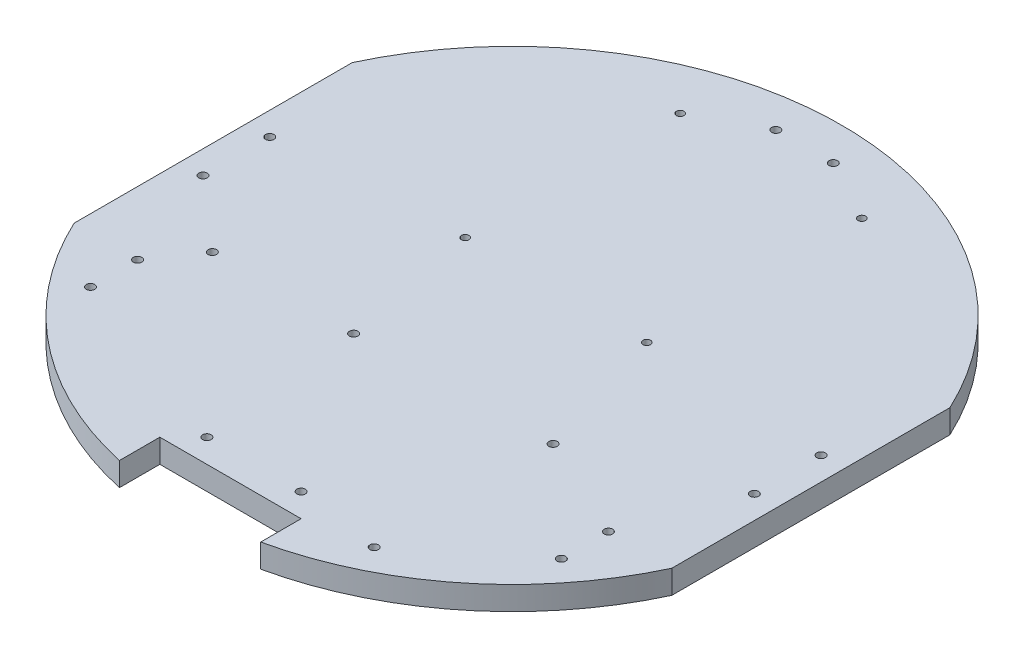
ISO-10303-21;
HEADER;
FILE_DESCRIPTION(('STEP AP214'),'2;1');
FILE_NAME('part.step','',(''),(''),'','','');
FILE_SCHEMA(('AUTOMOTIVE_DESIGN { 1 0 10303 214 1 1 1 1 }'));
ENDSEC;
DATA;
#1=APPLICATION_CONTEXT('core data for automotive mechanical design processes');
#2=APPLICATION_PROTOCOL_DEFINITION('international standard','automotive_design',2000,#1);
#3=PRODUCT_CONTEXT('',#1,'mechanical');
#4=PRODUCT('Part','Part','',(#3));
#5=PRODUCT_RELATED_PRODUCT_CATEGORY('part','',(#4));
#6=PRODUCT_DEFINITION_FORMATION('','',#4);
#7=PRODUCT_DEFINITION_CONTEXT('part definition',#1,'design');
#8=PRODUCT_DEFINITION('design','',#6,#7);
#9=PRODUCT_DEFINITION_SHAPE('','',#8);
#10=(LENGTH_UNIT() NAMED_UNIT(*) SI_UNIT(.MILLI.,.METRE.));
#11=(NAMED_UNIT(*) PLANE_ANGLE_UNIT() SI_UNIT($,.RADIAN.));
#12=(NAMED_UNIT(*) SI_UNIT($,.STERADIAN.) SOLID_ANGLE_UNIT());
#13=UNCERTAINTY_MEASURE_WITH_UNIT(LENGTH_MEASURE(1.E-05),#10,'distance_accuracy_value','');
#14=(GEOMETRIC_REPRESENTATION_CONTEXT(3) GLOBAL_UNCERTAINTY_ASSIGNED_CONTEXT((#13)) GLOBAL_UNIT_ASSIGNED_CONTEXT((#10,
#11,#12)) REPRESENTATION_CONTEXT('',''));
#15=CARTESIAN_POINT('',(0.,0.,0.));
#16=DIRECTION('',(0.,0.,1.));
#17=DIRECTION('',(1.,0.,0.));
#18=AXIS2_PLACEMENT_3D('',#15,#16,#17);
#19=CARTESIAN_POINT('',(0.,6.35,0.));
#20=DIRECTION('',(0.,-1.,0.));
#21=DIRECTION('',(0.,0.,-1.));
#22=AXIS2_PLACEMENT_3D('',#19,#20,#21);
#23=CYLINDRICAL_SURFACE('',#22,88.9);
#24=CARTESIAN_POINT('',(0.,0.,0.));
#25=DIRECTION('',(0.,1.,0.));
#26=DIRECTION('',(0.,0.,1.));
#27=AXIS2_PLACEMENT_3D('',#24,#25,#26);
#28=CIRCLE('',#27,88.9);
#29=CARTESIAN_POINT('',(-80.6037219984288,0.,37.5));
#30=VERTEX_POINT('',#29);
#31=CARTESIAN_POINT('',(-19.05,0.,86.8349440029761));
#32=VERTEX_POINT('',#31);
#33=EDGE_CURVE('E274',#30,#32,#28,.T.);
#34=ORIENTED_EDGE('',*,*,#33,.T.);
#35=DIRECTION('',(0.,-1.,0.));
#36=VECTOR('',#35,1.);
#37=CARTESIAN_POINT('',(-19.05,6.35,86.8349440029761));
#38=LINE('',#37,#36);
#39=CARTESIAN_POINT('',(-19.05,6.35,86.8349440029761));
#40=VERTEX_POINT('',#39);
#41=EDGE_CURVE('E121',#32,#40,#38,.F.);
#42=ORIENTED_EDGE('',*,*,#41,.T.);
#43=CARTESIAN_POINT('',(0.,6.35,0.));
#44=DIRECTION('',(0.,1.,0.));
#45=DIRECTION('',(0.,0.,1.));
#46=AXIS2_PLACEMENT_3D('',#43,#44,#45);
#47=CIRCLE('',#46,88.9);
#48=CARTESIAN_POINT('',(-80.6037219984288,6.35,37.5));
#49=VERTEX_POINT('',#48);
#50=EDGE_CURVE('E264',#49,#40,#47,.T.);
#51=ORIENTED_EDGE('',*,*,#50,.F.);
#52=DIRECTION('',(0.,-1.,0.));
#53=VECTOR('',#52,1.);
#54=CARTESIAN_POINT('',(-80.6037219984288,6.35,37.5));
#55=LINE('',#54,#53);
#56=EDGE_CURVE('E280',#49,#30,#55,.T.);
#57=ORIENTED_EDGE('',*,*,#56,.T.);
#58=EDGE_LOOP('',(#34,#42,#51,#57));
#59=FACE_BOUND('',#58,.T.);
#60=ADVANCED_FACE('F33',(#59),#23,.T.);
#61=CARTESIAN_POINT('',(0.,6.35,0.));
#62=DIRECTION('',(0.,-1.,0.));
#63=DIRECTION('',(0.,0.,-1.));
#64=AXIS2_PLACEMENT_3D('',#61,#62,#63);
#65=CYLINDRICAL_SURFACE('',#64,88.9);
#66=CARTESIAN_POINT('',(0.,0.,0.));
#67=DIRECTION('',(0.,1.,0.));
#68=DIRECTION('',(0.,0.,1.));
#69=AXIS2_PLACEMENT_3D('',#66,#67,#68);
#70=CIRCLE('',#69,88.9);
#71=CARTESIAN_POINT('',(80.6037219984288,0.,-37.5));
#72=VERTEX_POINT('',#71);
#73=CARTESIAN_POINT('',(-80.6037219984288,0.,-37.5));
#74=VERTEX_POINT('',#73);
#75=EDGE_CURVE('E259',#72,#74,#70,.T.);
#76=ORIENTED_EDGE('',*,*,#75,.T.);
#77=DIRECTION('',(0.,-1.,0.));
#78=VECTOR('',#77,1.);
#79=CARTESIAN_POINT('',(-80.6037219984288,6.35,-37.5));
#80=LINE('',#79,#78);
#81=CARTESIAN_POINT('',(-80.6037219984288,6.35,-37.5));
#82=VERTEX_POINT('',#81);
#83=EDGE_CURVE('E41',#82,#74,#80,.T.);
#84=ORIENTED_EDGE('',*,*,#83,.F.);
#85=CARTESIAN_POINT('',(0.,6.35,0.));
#86=DIRECTION('',(0.,1.,0.));
#87=DIRECTION('',(0.,0.,1.));
#88=AXIS2_PLACEMENT_3D('',#85,#86,#87);
#89=CIRCLE('',#88,88.9);
#90=CARTESIAN_POINT('',(80.6037219984288,6.35,-37.5));
#91=VERTEX_POINT('',#90);
#92=EDGE_CURVE('E260',#91,#82,#89,.T.);
#93=ORIENTED_EDGE('',*,*,#92,.F.);
#94=DIRECTION('',(0.,-1.,0.));
#95=VECTOR('',#94,1.);
#96=CARTESIAN_POINT('',(80.6037219984288,6.35,-37.5));
#97=LINE('',#96,#95);
#98=EDGE_CURVE('E268',#91,#72,#97,.T.);
#99=ORIENTED_EDGE('',*,*,#98,.T.);
#100=EDGE_LOOP('',(#76,#84,#93,#99));
#101=FACE_BOUND('',#100,.T.);
#102=ADVANCED_FACE('F35',(#101),#65,.T.);
#103=CARTESIAN_POINT('',(-80.6037219984288,6.35,-37.5));
#104=DIRECTION('',(1.,0.,0.));
#105=DIRECTION('',(0.,0.,-1.));
#106=AXIS2_PLACEMENT_3D('',#103,#104,#105);
#107=PLANE('',#106);
#108=DIRECTION('',(0.,0.,1.));
#109=VECTOR('',#108,1.);
#110=CARTESIAN_POINT('',(-80.6037219984288,0.,-37.5));
#111=LINE('',#110,#109);
#112=EDGE_CURVE('E271',#74,#30,#111,.T.);
#113=ORIENTED_EDGE('',*,*,#112,.T.);
#114=ORIENTED_EDGE('',*,*,#56,.F.);
#115=DIRECTION('',(0.,0.,1.));
#116=VECTOR('',#115,1.);
#117=CARTESIAN_POINT('',(-80.6037219984288,6.35,-37.5));
#118=LINE('',#117,#116);
#119=EDGE_CURVE('E86',#82,#49,#118,.T.);
#120=ORIENTED_EDGE('',*,*,#119,.F.);
#121=ORIENTED_EDGE('',*,*,#83,.T.);
#122=EDGE_LOOP('',(#113,#114,#120,#121));
#123=FACE_BOUND('',#122,.T.);
#124=ADVANCED_FACE('F283',(#123),#107,.F.);
#125=CARTESIAN_POINT('',(19.05,6.35,86.8349440029761));
#126=VERTEX_POINT('',#125);
#127=CARTESIAN_POINT('',(80.6037219984288,6.35,37.5));
#128=VERTEX_POINT('',#127);
#129=EDGE_CURVE('E263',#126,#128,#47,.T.);
#130=ORIENTED_EDGE('',*,*,#129,.F.);
#131=DIRECTION('',(0.,-1.,0.));
#132=VECTOR('',#131,1.);
#133=CARTESIAN_POINT('',(19.05,6.35,86.8349440029761));
#134=LINE('',#133,#132);
#135=CARTESIAN_POINT('',(19.05,0.,86.8349440029761));
#136=VERTEX_POINT('',#135);
#137=EDGE_CURVE('E114',#126,#136,#134,.T.);
#138=ORIENTED_EDGE('',*,*,#137,.T.);
#139=CARTESIAN_POINT('',(80.6037219984288,0.,37.5));
#140=VERTEX_POINT('',#139);
#141=EDGE_CURVE('E273',#136,#140,#28,.T.);
#142=ORIENTED_EDGE('',*,*,#141,.T.);
#143=DIRECTION('',(0.,-1.,0.));
#144=VECTOR('',#143,1.);
#145=CARTESIAN_POINT('',(80.6037219984288,6.35,37.5));
#146=LINE('',#145,#144);
#147=EDGE_CURVE('E278',#128,#140,#146,.T.);
#148=ORIENTED_EDGE('',*,*,#147,.F.);
#149=EDGE_LOOP('',(#130,#138,#142,#148));
#150=FACE_BOUND('',#149,.T.);
#151=ADVANCED_FACE('F296',(#150),#23,.T.);
#152=CARTESIAN_POINT('',(80.6037219984288,6.35,-37.5));
#153=DIRECTION('',(-1.,0.,0.));
#154=DIRECTION('',(0.,0.,1.));
#155=AXIS2_PLACEMENT_3D('',#152,#153,#154);
#156=PLANE('',#155);
#157=DIRECTION('',(0.,0.,-1.));
#158=VECTOR('',#157,1.);
#159=CARTESIAN_POINT('',(80.6037219984288,0.,-37.5));
#160=LINE('',#159,#158);
#161=EDGE_CURVE('E78',#140,#72,#160,.T.);
#162=ORIENTED_EDGE('',*,*,#161,.T.);
#163=ORIENTED_EDGE('',*,*,#98,.F.);
#164=DIRECTION('',(0.,0.,-1.));
#165=VECTOR('',#164,1.);
#166=CARTESIAN_POINT('',(80.6037219984288,6.35,-37.5));
#167=LINE('',#166,#165);
#168=EDGE_CURVE('E57',#128,#91,#167,.T.);
#169=ORIENTED_EDGE('',*,*,#168,.F.);
#170=ORIENTED_EDGE('',*,*,#147,.T.);
#171=EDGE_LOOP('',(#162,#163,#169,#170));
#172=FACE_BOUND('',#171,.T.);
#173=ADVANCED_FACE('F297',(#172),#156,.F.);
#174=CARTESIAN_POINT('',(0.,6.35,0.));
#175=DIRECTION('',(0.,1.,0.));
#176=DIRECTION('',(0.,0.,1.));
#177=AXIS2_PLACEMENT_3D('',#174,#175,#176);
#178=PLANE('',#177);
#179=DIRECTION('',(0.,0.,1.));
#180=VECTOR('',#179,1.);
#181=CARTESIAN_POINT('',(-19.05,6.35,101.854));
#182=LINE('',#181,#180);
#183=CARTESIAN_POINT('',(-19.05,6.35,75.946));
#184=VERTEX_POINT('',#183);
#185=EDGE_CURVE('E128',#184,#40,#182,.T.);
#186=ORIENTED_EDGE('',*,*,#185,.F.);
#187=DIRECTION('',(-1.,0.,0.));
#188=VECTOR('',#187,1.);
#189=CARTESIAN_POINT('',(19.05,6.35,75.946));
#190=LINE('',#189,#188);
#191=CARTESIAN_POINT('',(19.05,6.35,75.946));
#192=VERTEX_POINT('',#191);
#193=EDGE_CURVE('E111',#192,#184,#190,.T.);
#194=ORIENTED_EDGE('',*,*,#193,.F.);
#195=DIRECTION('',(0.,0.,-1.));
#196=VECTOR('',#195,1.);
#197=CARTESIAN_POINT('',(19.05,6.35,101.854));
#198=LINE('',#197,#196);
#199=EDGE_CURVE('E132',#126,#192,#198,.T.);
#200=ORIENTED_EDGE('',*,*,#199,.F.);
#201=ORIENTED_EDGE('',*,*,#129,.T.);
#202=ORIENTED_EDGE('',*,*,#168,.T.);
#203=ORIENTED_EDGE('',*,*,#92,.T.);
#204=ORIENTED_EDGE('',*,*,#119,.T.);
#205=ORIENTED_EDGE('',*,*,#50,.T.);
#206=EDGE_LOOP('',(#186,#194,#200,#201,#202,#203,#204,#205));
#207=FACE_BOUND('',#206,.T.);
#208=CARTESIAN_POINT('',(-17.1037219984288,6.35,25.6290866600361));
#209=DIRECTION('',(0.,1.,0.));
#210=DIRECTION('',(0.,0.,1.));
#211=AXIS2_PLACEMENT_3D('',#208,#209,#210);
#212=CIRCLE('',#211,1.143);
#213=CARTESIAN_POINT('',(-17.1037219984288,6.35,26.7720866600361));
#214=VERTEX_POINT('',#213);
#215=EDGE_CURVE('E139',#214,#214,#212,.T.);
#216=ORIENTED_EDGE('',*,*,#215,.F.);
#217=EDGE_LOOP('',(#216));
#218=FACE_BOUND('',#217,.T.);
#219=CARTESIAN_POINT('',(-55.2037219984288,6.35,25.6290866600361));
#220=DIRECTION('',(0.,1.,0.));
#221=DIRECTION('',(0.,0.,1.));
#222=AXIS2_PLACEMENT_3D('',#219,#220,#221);
#223=CIRCLE('',#222,1.143);
#224=CARTESIAN_POINT('',(-55.2037219984288,6.35,26.7720866600361));
#225=VERTEX_POINT('',#224);
#226=EDGE_CURVE('E143',#225,#225,#223,.T.);
#227=ORIENTED_EDGE('',*,*,#226,.F.);
#228=EDGE_LOOP('',(#227));
#229=FACE_BOUND('',#228,.T.);
#230=CARTESIAN_POINT('',(63.5,6.35,37.5));
#231=DIRECTION('',(0.,1.,0.));
#232=DIRECTION('',(0.,0.,-1.));
#233=AXIS2_PLACEMENT_3D('',#230,#231,#232);
#234=CIRCLE('',#233,1.14300000000002);
#235=CARTESIAN_POINT('',(63.5,6.35,36.357));
#236=VERTEX_POINT('',#235);
#237=EDGE_CURVE('E149',#236,#236,#234,.T.);
#238=ORIENTED_EDGE('',*,*,#237,.F.);
#239=EDGE_LOOP('',(#238));
#240=FACE_BOUND('',#239,.T.);
#241=CARTESIAN_POINT('',(63.5,6.35,50.2));
#242=DIRECTION('',(0.,1.,0.));
#243=DIRECTION('',(0.,0.,-1.));
#244=AXIS2_PLACEMENT_3D('',#241,#242,#243);
#245=CIRCLE('',#244,1.14300000000002);
#246=CARTESIAN_POINT('',(63.5,6.35,49.057));
#247=VERTEX_POINT('',#246);
#248=EDGE_CURVE('E155',#247,#247,#245,.T.);
#249=ORIENTED_EDGE('',*,*,#248,.F.);
#250=EDGE_LOOP('',(#249));
#251=FACE_BOUND('',#250,.T.);
#252=CARTESIAN_POINT('',(-63.5,6.35,50.2));
#253=DIRECTION('',(0.,1.,0.));
#254=DIRECTION('',(0.,0.,1.));
#255=AXIS2_PLACEMENT_3D('',#252,#253,#254);
#256=CIRCLE('',#255,1.14300000000002);
#257=CARTESIAN_POINT('',(-63.5,6.35,51.343));
#258=VERTEX_POINT('',#257);
#259=EDGE_CURVE('E161',#258,#258,#256,.T.);
#260=ORIENTED_EDGE('',*,*,#259,.F.);
#261=EDGE_LOOP('',(#260));
#262=FACE_BOUND('',#261,.T.);
#263=CARTESIAN_POINT('',(-63.5,6.35,37.5));
#264=DIRECTION('',(0.,1.,0.));
#265=DIRECTION('',(0.,0.,1.));
#266=AXIS2_PLACEMENT_3D('',#263,#264,#265);
#267=CIRCLE('',#266,1.14300000000002);
#268=CARTESIAN_POINT('',(-63.5,6.35,38.643));
#269=VERTEX_POINT('',#268);
#270=EDGE_CURVE('E167',#269,#269,#267,.T.);
#271=ORIENTED_EDGE('',*,*,#270,.F.);
#272=EDGE_LOOP('',(#271));
#273=FACE_BOUND('',#272,.T.);
#274=CARTESIAN_POINT('',(12.7,6.35,69.596));
#275=DIRECTION('',(0.,1.,0.));
#276=DIRECTION('',(0.,0.,1.));
#277=AXIS2_PLACEMENT_3D('',#274,#275,#276);
#278=CIRCLE('',#277,1.14299999999999);
#279=CARTESIAN_POINT('',(12.7,6.35,70.739));
#280=VERTEX_POINT('',#279);
#281=EDGE_CURVE('E173',#280,#280,#278,.T.);
#282=ORIENTED_EDGE('',*,*,#281,.F.);
#283=EDGE_LOOP('',(#282));
#284=FACE_BOUND('',#283,.T.);
#285=CARTESIAN_POINT('',(-12.7,6.35,69.596));
#286=DIRECTION('',(0.,1.,0.));
#287=DIRECTION('',(0.,0.,1.));
#288=AXIS2_PLACEMENT_3D('',#285,#286,#287);
#289=CIRCLE('',#288,1.14300000000001);
#290=CARTESIAN_POINT('',(-12.7,6.35,70.739));
#291=VERTEX_POINT('',#290);
#292=EDGE_CURVE('E179',#291,#291,#289,.T.);
#293=ORIENTED_EDGE('',*,*,#292,.F.);
#294=EDGE_LOOP('',(#293));
#295=FACE_BOUND('',#294,.T.);
#296=CARTESIAN_POINT('',(35.56,6.35,72.746086660036));
#297=DIRECTION('',(0.,1.,0.));
#298=DIRECTION('',(0.,0.,1.));
#299=AXIS2_PLACEMENT_3D('',#296,#297,#298);
#300=CIRCLE('',#299,1.143);
#301=CARTESIAN_POINT('',(35.56,6.35,73.889086660036));
#302=VERTEX_POINT('',#301);
#303=EDGE_CURVE('E185',#302,#302,#300,.T.);
#304=ORIENTED_EDGE('',*,*,#303,.F.);
#305=EDGE_LOOP('',(#304));
#306=FACE_BOUND('',#305,.T.);
#307=CARTESIAN_POINT('',(35.56,6.35,24.486086660036));
#308=DIRECTION('',(0.,1.,0.));
#309=DIRECTION('',(0.,0.,1.));
#310=AXIS2_PLACEMENT_3D('',#307,#308,#309);
#311=CIRCLE('',#310,1.143);
#312=CARTESIAN_POINT('',(35.56,6.35,25.629086660036));
#313=VERTEX_POINT('',#312);
#314=EDGE_CURVE('E191',#313,#313,#311,.T.);
#315=ORIENTED_EDGE('',*,*,#314,.F.);
#316=EDGE_LOOP('',(#315));
#317=FACE_BOUND('',#316,.T.);
#318=CARTESIAN_POINT('',(7.747,6.35,-78.9));
#319=DIRECTION('',(0.,1.,0.));
#320=DIRECTION('',(0.,0.,1.));
#321=AXIS2_PLACEMENT_3D('',#318,#319,#320);
#322=CIRCLE('',#321,1.14300000000001);
#323=CARTESIAN_POINT('',(7.747,6.35,-77.757));
#324=VERTEX_POINT('',#323);
#325=EDGE_CURVE('E197',#324,#324,#322,.T.);
#326=ORIENTED_EDGE('',*,*,#325,.F.);
#327=EDGE_LOOP('',(#326));
#328=FACE_BOUND('',#327,.T.);
#329=CARTESIAN_POINT('',(-7.747,6.35,-78.9));
#330=DIRECTION('',(0.,1.,0.));
#331=DIRECTION('',(0.,0.,1.));
#332=AXIS2_PLACEMENT_3D('',#329,#330,#331);
#333=CIRCLE('',#332,1.14299999999999);
#334=CARTESIAN_POINT('',(-7.747,6.35,-77.757));
#335=VERTEX_POINT('',#334);
#336=EDGE_CURVE('E205',#335,#335,#333,.T.);
#337=ORIENTED_EDGE('',*,*,#336,.F.);
#338=EDGE_LOOP('',(#337));
#339=FACE_BOUND('',#338,.T.);
#340=CARTESIAN_POINT('',(74.3537219984288,6.35,9.));
#341=DIRECTION('',(0.,1.,0.));
#342=DIRECTION('',(0.,0.,-1.));
#343=AXIS2_PLACEMENT_3D('',#340,#341,#342);
#344=CIRCLE('',#343,1.14299999999999);
#345=CARTESIAN_POINT('',(74.3537219984288,6.35,7.85700000000001));
#346=VERTEX_POINT('',#345);
#347=EDGE_CURVE('E211',#346,#346,#344,.T.);
#348=ORIENTED_EDGE('',*,*,#347,.F.);
#349=EDGE_LOOP('',(#348));
#350=FACE_BOUND('',#349,.T.);
#351=CARTESIAN_POINT('',(74.3537219984288,6.35,-9.));
#352=DIRECTION('',(0.,1.,0.));
#353=DIRECTION('',(0.,0.,-1.));
#354=AXIS2_PLACEMENT_3D('',#351,#352,#353);
#355=CIRCLE('',#354,1.14299999999999);
#356=CARTESIAN_POINT('',(74.3537219984288,6.35,-10.143));
#357=VERTEX_POINT('',#356);
#358=EDGE_CURVE('E217',#357,#357,#355,.T.);
#359=ORIENTED_EDGE('',*,*,#358,.F.);
#360=EDGE_LOOP('',(#359));
#361=FACE_BOUND('',#360,.T.);
#362=CARTESIAN_POINT('',(-74.3537219984288,6.35,9.));
#363=DIRECTION('',(0.,1.,0.));
#364=DIRECTION('',(0.,0.,1.));
#365=AXIS2_PLACEMENT_3D('',#362,#363,#364);
#366=CIRCLE('',#365,1.14299999999999);
#367=CARTESIAN_POINT('',(-74.3537219984288,6.35,10.143));
#368=VERTEX_POINT('',#367);
#369=EDGE_CURVE('E223',#368,#368,#366,.T.);
#370=ORIENTED_EDGE('',*,*,#369,.F.);
#371=EDGE_LOOP('',(#370));
#372=FACE_BOUND('',#371,.T.);
#373=CARTESIAN_POINT('',(-74.3537219984288,6.35,-9.));
#374=DIRECTION('',(0.,1.,0.));
#375=DIRECTION('',(0.,0.,1.));
#376=AXIS2_PLACEMENT_3D('',#373,#374,#375);
#377=CIRCLE('',#376,1.14299999999999);
#378=CARTESIAN_POINT('',(-74.3537219984288,6.35,-7.85700000000001));
#379=VERTEX_POINT('',#378);
#380=EDGE_CURVE('E229',#379,#379,#377,.T.);
#381=ORIENTED_EDGE('',*,*,#380,.F.);
#382=EDGE_LOOP('',(#381));
#383=FACE_BOUND('',#382,.T.);
#384=CARTESIAN_POINT('',(-24.5,6.35,-69.85));
#385=DIRECTION('',(0.,1.,0.));
#386=DIRECTION('',(0.,0.,1.));
#387=AXIS2_PLACEMENT_3D('',#384,#385,#386);
#388=CIRCLE('',#387,1.025);
#389=CARTESIAN_POINT('',(-24.5,6.35,-68.825));
#390=VERTEX_POINT('',#389);
#391=EDGE_CURVE('E235',#390,#390,#388,.T.);
#392=ORIENTED_EDGE('',*,*,#391,.F.);
#393=EDGE_LOOP('',(#392));
#394=FACE_BOUND('',#393,.T.);
#395=CARTESIAN_POINT('',(-24.5,6.35,-11.85));
#396=DIRECTION('',(0.,1.,0.));
#397=DIRECTION('',(0.,0.,1.));
#398=AXIS2_PLACEMENT_3D('',#395,#396,#397);
#399=CIRCLE('',#398,1.025);
#400=CARTESIAN_POINT('',(-24.5,6.35,-10.825));
#401=VERTEX_POINT('',#400);
#402=EDGE_CURVE('E241',#401,#401,#399,.T.);
#403=ORIENTED_EDGE('',*,*,#402,.F.);
#404=EDGE_LOOP('',(#403));
#405=FACE_BOUND('',#404,.T.);
#406=CARTESIAN_POINT('',(24.5,6.35,-11.85));
#407=DIRECTION('',(0.,1.,0.));
#408=DIRECTION('',(0.,0.,1.));
#409=AXIS2_PLACEMENT_3D('',#406,#407,#408);
#410=CIRCLE('',#409,1.025);
#411=CARTESIAN_POINT('',(24.5,6.35,-10.825));
#412=VERTEX_POINT('',#411);
#413=EDGE_CURVE('E247',#412,#412,#410,.T.);
#414=ORIENTED_EDGE('',*,*,#413,.F.);
#415=EDGE_LOOP('',(#414));
#416=FACE_BOUND('',#415,.T.);
#417=CARTESIAN_POINT('',(24.5,6.35,-69.85));
#418=DIRECTION('',(0.,1.,0.));
#419=DIRECTION('',(0.,0.,1.));
#420=AXIS2_PLACEMENT_3D('',#417,#418,#419);
#421=CIRCLE('',#420,1.02499999999999);
#422=CARTESIAN_POINT('',(24.5,6.35,-68.825));
#423=VERTEX_POINT('',#422);
#424=EDGE_CURVE('E253',#423,#423,#421,.T.);
#425=ORIENTED_EDGE('',*,*,#424,.F.);
#426=EDGE_LOOP('',(#425));
#427=FACE_BOUND('',#426,.T.);
#428=ADVANCED_FACE('F289',(#207,#218,#229,#240,#251,#262,#273,#284,#295,#306,#317,#328,#339,
#350,#361,#372,#383,#394,#405,#416,#427),#178,.T.);
#429=CARTESIAN_POINT('',(0.,0.,0.));
#430=DIRECTION('',(0.,1.,0.));
#431=DIRECTION('',(0.,0.,1.));
#432=AXIS2_PLACEMENT_3D('',#429,#430,#431);
#433=PLANE('',#432);
#434=CARTESIAN_POINT('',(-17.1037219984288,0.,25.6290866600361));
#435=DIRECTION('',(0.,1.,0.));
#436=DIRECTION('',(0.,0.,1.));
#437=AXIS2_PLACEMENT_3D('',#434,#435,#436);
#438=CIRCLE('',#437,1.143);
#439=CARTESIAN_POINT('',(-17.1037219984288,0.,26.7720866600361));
#440=VERTEX_POINT('',#439);
#441=EDGE_CURVE('E140',#440,#440,#438,.T.);
#442=ORIENTED_EDGE('',*,*,#441,.T.);
#443=EDGE_LOOP('',(#442));
#444=FACE_BOUND('',#443,.T.);
#445=CARTESIAN_POINT('',(-55.2037219984288,0.,25.6290866600361));
#446=DIRECTION('',(0.,1.,0.));
#447=DIRECTION('',(0.,0.,1.));
#448=AXIS2_PLACEMENT_3D('',#445,#446,#447);
#449=CIRCLE('',#448,1.143);
#450=CARTESIAN_POINT('',(-55.2037219984288,0.,26.7720866600361));
#451=VERTEX_POINT('',#450);
#452=EDGE_CURVE('E146',#451,#451,#449,.T.);
#453=ORIENTED_EDGE('',*,*,#452,.T.);
#454=EDGE_LOOP('',(#453));
#455=FACE_BOUND('',#454,.T.);
#456=CARTESIAN_POINT('',(63.5,0.,37.5));
#457=DIRECTION('',(0.,1.,0.));
#458=DIRECTION('',(0.,0.,-1.));
#459=AXIS2_PLACEMENT_3D('',#456,#457,#458);
#460=CIRCLE('',#459,1.14300000000002);
#461=CARTESIAN_POINT('',(63.5,0.,36.357));
#462=VERTEX_POINT('',#461);
#463=EDGE_CURVE('E152',#462,#462,#460,.T.);
#464=ORIENTED_EDGE('',*,*,#463,.T.);
#465=EDGE_LOOP('',(#464));
#466=FACE_BOUND('',#465,.T.);
#467=CARTESIAN_POINT('',(63.5,0.,50.2));
#468=DIRECTION('',(0.,1.,0.));
#469=DIRECTION('',(0.,0.,-1.));
#470=AXIS2_PLACEMENT_3D('',#467,#468,#469);
#471=CIRCLE('',#470,1.14300000000002);
#472=CARTESIAN_POINT('',(63.5,0.,49.057));
#473=VERTEX_POINT('',#472);
#474=EDGE_CURVE('E158',#473,#473,#471,.T.);
#475=ORIENTED_EDGE('',*,*,#474,.T.);
#476=EDGE_LOOP('',(#475));
#477=FACE_BOUND('',#476,.T.);
#478=CARTESIAN_POINT('',(-63.5,0.,50.2));
#479=DIRECTION('',(0.,1.,0.));
#480=DIRECTION('',(0.,0.,1.));
#481=AXIS2_PLACEMENT_3D('',#478,#479,#480);
#482=CIRCLE('',#481,1.14300000000002);
#483=CARTESIAN_POINT('',(-63.5,0.,51.343));
#484=VERTEX_POINT('',#483);
#485=EDGE_CURVE('E164',#484,#484,#482,.T.);
#486=ORIENTED_EDGE('',*,*,#485,.T.);
#487=EDGE_LOOP('',(#486));
#488=FACE_BOUND('',#487,.T.);
#489=CARTESIAN_POINT('',(-63.5,0.,37.5));
#490=DIRECTION('',(0.,1.,0.));
#491=DIRECTION('',(0.,0.,1.));
#492=AXIS2_PLACEMENT_3D('',#489,#490,#491);
#493=CIRCLE('',#492,1.14300000000002);
#494=CARTESIAN_POINT('',(-63.5,0.,38.643));
#495=VERTEX_POINT('',#494);
#496=EDGE_CURVE('E170',#495,#495,#493,.T.);
#497=ORIENTED_EDGE('',*,*,#496,.T.);
#498=EDGE_LOOP('',(#497));
#499=FACE_BOUND('',#498,.T.);
#500=CARTESIAN_POINT('',(12.7,0.,69.596));
#501=DIRECTION('',(0.,1.,0.));
#502=DIRECTION('',(0.,0.,1.));
#503=AXIS2_PLACEMENT_3D('',#500,#501,#502);
#504=CIRCLE('',#503,1.14299999999999);
#505=CARTESIAN_POINT('',(12.7,0.,70.739));
#506=VERTEX_POINT('',#505);
#507=EDGE_CURVE('E176',#506,#506,#504,.T.);
#508=ORIENTED_EDGE('',*,*,#507,.T.);
#509=EDGE_LOOP('',(#508));
#510=FACE_BOUND('',#509,.T.);
#511=CARTESIAN_POINT('',(-12.7,0.,69.596));
#512=DIRECTION('',(0.,1.,0.));
#513=DIRECTION('',(0.,0.,1.));
#514=AXIS2_PLACEMENT_3D('',#511,#512,#513);
#515=CIRCLE('',#514,1.14300000000001);
#516=CARTESIAN_POINT('',(-12.7,0.,70.739));
#517=VERTEX_POINT('',#516);
#518=EDGE_CURVE('E182',#517,#517,#515,.T.);
#519=ORIENTED_EDGE('',*,*,#518,.T.);
#520=EDGE_LOOP('',(#519));
#521=FACE_BOUND('',#520,.T.);
#522=CARTESIAN_POINT('',(35.56,0.,72.746086660036));
#523=DIRECTION('',(0.,1.,0.));
#524=DIRECTION('',(0.,0.,1.));
#525=AXIS2_PLACEMENT_3D('',#522,#523,#524);
#526=CIRCLE('',#525,1.143);
#527=CARTESIAN_POINT('',(35.56,0.,73.889086660036));
#528=VERTEX_POINT('',#527);
#529=EDGE_CURVE('E188',#528,#528,#526,.T.);
#530=ORIENTED_EDGE('',*,*,#529,.T.);
#531=EDGE_LOOP('',(#530));
#532=FACE_BOUND('',#531,.T.);
#533=CARTESIAN_POINT('',(35.56,0.,24.486086660036));
#534=DIRECTION('',(0.,1.,0.));
#535=DIRECTION('',(0.,0.,1.));
#536=AXIS2_PLACEMENT_3D('',#533,#534,#535);
#537=CIRCLE('',#536,1.143);
#538=CARTESIAN_POINT('',(35.56,0.,25.629086660036));
#539=VERTEX_POINT('',#538);
#540=EDGE_CURVE('E194',#539,#539,#537,.T.);
#541=ORIENTED_EDGE('',*,*,#540,.T.);
#542=EDGE_LOOP('',(#541));
#543=FACE_BOUND('',#542,.T.);
#544=CARTESIAN_POINT('',(7.747,0.,-78.9));
#545=DIRECTION('',(0.,1.,0.));
#546=DIRECTION('',(0.,0.,1.));
#547=AXIS2_PLACEMENT_3D('',#544,#545,#546);
#548=CIRCLE('',#547,1.14300000000001);
#549=CARTESIAN_POINT('',(7.747,0.,-77.757));
#550=VERTEX_POINT('',#549);
#551=EDGE_CURVE('E202',#550,#550,#548,.F.);
#552=ORIENTED_EDGE('',*,*,#551,.F.);
#553=EDGE_LOOP('',(#552));
#554=FACE_BOUND('',#553,.T.);
#555=CARTESIAN_POINT('',(-7.747,0.,-78.9));
#556=DIRECTION('',(0.,1.,0.));
#557=DIRECTION('',(0.,0.,1.));
#558=AXIS2_PLACEMENT_3D('',#555,#556,#557);
#559=CIRCLE('',#558,1.14299999999999);
#560=CARTESIAN_POINT('',(-7.747,0.,-77.757));
#561=VERTEX_POINT('',#560);
#562=EDGE_CURVE('E208',#561,#561,#559,.F.);
#563=ORIENTED_EDGE('',*,*,#562,.F.);
#564=EDGE_LOOP('',(#563));
#565=FACE_BOUND('',#564,.T.);
#566=CARTESIAN_POINT('',(74.3537219984288,0.,9.));
#567=DIRECTION('',(0.,1.,0.));
#568=DIRECTION('',(0.,0.,1.));
#569=AXIS2_PLACEMENT_3D('',#566,#567,#568);
#570=CIRCLE('',#569,1.14299999999999);
#571=CARTESIAN_POINT('',(74.3537219984288,0.,10.143));
#572=VERTEX_POINT('',#571);
#573=EDGE_CURVE('E214',#572,#572,#570,.F.);
#574=ORIENTED_EDGE('',*,*,#573,.F.);
#575=EDGE_LOOP('',(#574));
#576=FACE_BOUND('',#575,.T.);
#577=CARTESIAN_POINT('',(74.3537219984288,0.,-9.));
#578=DIRECTION('',(0.,1.,0.));
#579=DIRECTION('',(0.,0.,1.));
#580=AXIS2_PLACEMENT_3D('',#577,#578,#579);
#581=CIRCLE('',#580,1.14299999999999);
#582=CARTESIAN_POINT('',(74.3537219984288,0.,-7.85700000000001));
#583=VERTEX_POINT('',#582);
#584=EDGE_CURVE('E220',#583,#583,#581,.F.);
#585=ORIENTED_EDGE('',*,*,#584,.F.);
#586=EDGE_LOOP('',(#585));
#587=FACE_BOUND('',#586,.T.);
#588=CARTESIAN_POINT('',(-74.3537219984288,0.,9.));
#589=DIRECTION('',(0.,1.,0.));
#590=DIRECTION('',(0.,0.,1.));
#591=AXIS2_PLACEMENT_3D('',#588,#589,#590);
#592=CIRCLE('',#591,1.14299999999999);
#593=CARTESIAN_POINT('',(-74.3537219984288,0.,10.143));
#594=VERTEX_POINT('',#593);
#595=EDGE_CURVE('E226',#594,#594,#592,.F.);
#596=ORIENTED_EDGE('',*,*,#595,.F.);
#597=EDGE_LOOP('',(#596));
#598=FACE_BOUND('',#597,.T.);
#599=CARTESIAN_POINT('',(-74.3537219984288,0.,-9.));
#600=DIRECTION('',(0.,1.,0.));
#601=DIRECTION('',(0.,0.,1.));
#602=AXIS2_PLACEMENT_3D('',#599,#600,#601);
#603=CIRCLE('',#602,1.14299999999999);
#604=CARTESIAN_POINT('',(-74.3537219984288,0.,-7.85700000000001));
#605=VERTEX_POINT('',#604);
#606=EDGE_CURVE('E232',#605,#605,#603,.F.);
#607=ORIENTED_EDGE('',*,*,#606,.F.);
#608=EDGE_LOOP('',(#607));
#609=FACE_BOUND('',#608,.T.);
#610=CARTESIAN_POINT('',(-24.5,0.,-69.85));
#611=DIRECTION('',(0.,1.,0.));
#612=DIRECTION('',(0.,0.,1.));
#613=AXIS2_PLACEMENT_3D('',#610,#611,#612);
#614=CIRCLE('',#613,1.025);
#615=CARTESIAN_POINT('',(-24.5,0.,-68.825));
#616=VERTEX_POINT('',#615);
#617=EDGE_CURVE('E238',#616,#616,#614,.F.);
#618=ORIENTED_EDGE('',*,*,#617,.F.);
#619=EDGE_LOOP('',(#618));
#620=FACE_BOUND('',#619,.T.);
#621=CARTESIAN_POINT('',(-24.5,0.,-11.85));
#622=DIRECTION('',(0.,1.,0.));
#623=DIRECTION('',(0.,0.,1.));
#624=AXIS2_PLACEMENT_3D('',#621,#622,#623);
#625=CIRCLE('',#624,1.025);
#626=CARTESIAN_POINT('',(-24.5,0.,-10.825));
#627=VERTEX_POINT('',#626);
#628=EDGE_CURVE('E244',#627,#627,#625,.F.);
#629=ORIENTED_EDGE('',*,*,#628,.F.);
#630=EDGE_LOOP('',(#629));
#631=FACE_BOUND('',#630,.T.);
#632=CARTESIAN_POINT('',(24.5,0.,-11.85));
#633=DIRECTION('',(0.,1.,0.));
#634=DIRECTION('',(0.,0.,1.));
#635=AXIS2_PLACEMENT_3D('',#632,#633,#634);
#636=CIRCLE('',#635,1.025);
#637=CARTESIAN_POINT('',(24.5,0.,-10.825));
#638=VERTEX_POINT('',#637);
#639=EDGE_CURVE('E250',#638,#638,#636,.F.);
#640=ORIENTED_EDGE('',*,*,#639,.F.);
#641=EDGE_LOOP('',(#640));
#642=FACE_BOUND('',#641,.T.);
#643=CARTESIAN_POINT('',(24.5,0.,-69.85));
#644=DIRECTION('',(0.,1.,0.));
#645=DIRECTION('',(0.,0.,1.));
#646=AXIS2_PLACEMENT_3D('',#643,#644,#645);
#647=CIRCLE('',#646,1.02499999999999);
#648=CARTESIAN_POINT('',(24.5,0.,-68.825));
#649=VERTEX_POINT('',#648);
#650=EDGE_CURVE('E256',#649,#649,#647,.F.);
#651=ORIENTED_EDGE('',*,*,#650,.F.);
#652=EDGE_LOOP('',(#651));
#653=FACE_BOUND('',#652,.T.);
#654=DIRECTION('',(-1.,0.,0.));
#655=VECTOR('',#654,1.);
#656=CARTESIAN_POINT('',(19.05,0.,75.946));
#657=LINE('',#656,#655);
#658=CARTESIAN_POINT('',(19.05,0.,75.946));
#659=VERTEX_POINT('',#658);
#660=CARTESIAN_POINT('',(-19.05,0.,75.946));
#661=VERTEX_POINT('',#660);
#662=EDGE_CURVE('E48',#659,#661,#657,.T.);
#663=ORIENTED_EDGE('',*,*,#662,.T.);
#664=DIRECTION('',(0.,0.,1.));
#665=VECTOR('',#664,1.);
#666=CARTESIAN_POINT('',(-19.05,0.,101.854));
#667=LINE('',#666,#665);
#668=EDGE_CURVE('E118',#661,#32,#667,.T.);
#669=ORIENTED_EDGE('',*,*,#668,.T.);
#670=ORIENTED_EDGE('',*,*,#33,.F.);
#671=ORIENTED_EDGE('',*,*,#112,.F.);
#672=ORIENTED_EDGE('',*,*,#75,.F.);
#673=ORIENTED_EDGE('',*,*,#161,.F.);
#674=ORIENTED_EDGE('',*,*,#141,.F.);
#675=DIRECTION('',(0.,0.,-1.));
#676=VECTOR('',#675,1.);
#677=CARTESIAN_POINT('',(19.05,0.,0.));
#678=LINE('',#677,#676);
#679=EDGE_CURVE('E11',#136,#659,#678,.T.);
#680=ORIENTED_EDGE('',*,*,#679,.T.);
#681=EDGE_LOOP('',(#663,#669,#670,#671,#672,#673,#674,#680));
#682=FACE_BOUND('',#681,.T.);
#683=ADVANCED_FACE('F126',(#444,#455,#466,#477,#488,#499,#510,#521,#532,#543,#554,#565,#576,
#587,#598,#609,#620,#631,#642,#653,#682),#433,.F.);
#684=CARTESIAN_POINT('',(24.5,-0.00100000000000013,-69.85));
#685=DIRECTION('',(0.,1.,0.));
#686=DIRECTION('',(0.,0.,1.));
#687=AXIS2_PLACEMENT_3D('',#684,#685,#686);
#688=CYLINDRICAL_SURFACE('',#687,1.02499999999999);
#689=ORIENTED_EDGE('',*,*,#424,.T.);
#690=EDGE_LOOP('',(#689));
#691=FACE_BOUND('',#690,.T.);
#692=ORIENTED_EDGE('',*,*,#650,.T.);
#693=EDGE_LOOP('',(#692));
#694=FACE_BOUND('',#693,.T.);
#695=ADVANCED_FACE('F334',(#691,#694),#688,.F.);
#696=CARTESIAN_POINT('',(24.5,-0.00100000000000013,-11.85));
#697=DIRECTION('',(0.,1.,0.));
#698=DIRECTION('',(0.,0.,1.));
#699=AXIS2_PLACEMENT_3D('',#696,#697,#698);
#700=CYLINDRICAL_SURFACE('',#699,1.025);
#701=ORIENTED_EDGE('',*,*,#413,.T.);
#702=EDGE_LOOP('',(#701));
#703=FACE_BOUND('',#702,.T.);
#704=ORIENTED_EDGE('',*,*,#639,.T.);
#705=EDGE_LOOP('',(#704));
#706=FACE_BOUND('',#705,.T.);
#707=ADVANCED_FACE('F436',(#703,#706),#700,.F.);
#708=CARTESIAN_POINT('',(-24.5,-0.00100000000000013,-11.85));
#709=DIRECTION('',(0.,1.,0.));
#710=DIRECTION('',(0.,0.,1.));
#711=AXIS2_PLACEMENT_3D('',#708,#709,#710);
#712=CYLINDRICAL_SURFACE('',#711,1.025);
#713=ORIENTED_EDGE('',*,*,#402,.T.);
#714=EDGE_LOOP('',(#713));
#715=FACE_BOUND('',#714,.T.);
#716=ORIENTED_EDGE('',*,*,#628,.T.);
#717=EDGE_LOOP('',(#716));
#718=FACE_BOUND('',#717,.T.);
#719=ADVANCED_FACE('F432',(#715,#718),#712,.F.);
#720=CARTESIAN_POINT('',(-24.5,-0.00100000000000013,-69.85));
#721=DIRECTION('',(0.,1.,0.));
#722=DIRECTION('',(0.,0.,1.));
#723=AXIS2_PLACEMENT_3D('',#720,#721,#722);
#724=CYLINDRICAL_SURFACE('',#723,1.025);
#725=ORIENTED_EDGE('',*,*,#391,.T.);
#726=EDGE_LOOP('',(#725));
#727=FACE_BOUND('',#726,.T.);
#728=ORIENTED_EDGE('',*,*,#617,.T.);
#729=EDGE_LOOP('',(#728));
#730=FACE_BOUND('',#729,.T.);
#731=ADVANCED_FACE('F428',(#727,#730),#724,.F.);
#732=CARTESIAN_POINT('',(-74.3537219984288,-0.00100000000000013,-9.));
#733=DIRECTION('',(0.,1.,0.));
#734=DIRECTION('',(0.,0.,1.));
#735=AXIS2_PLACEMENT_3D('',#732,#733,#734);
#736=CYLINDRICAL_SURFACE('',#735,1.14299999999999);
#737=ORIENTED_EDGE('',*,*,#380,.T.);
#738=EDGE_LOOP('',(#737));
#739=FACE_BOUND('',#738,.T.);
#740=ORIENTED_EDGE('',*,*,#606,.T.);
#741=EDGE_LOOP('',(#740));
#742=FACE_BOUND('',#741,.T.);
#743=ADVANCED_FACE('F424',(#739,#742),#736,.F.);
#744=CARTESIAN_POINT('',(-74.3537219984288,-0.00100000000000013,9.));
#745=DIRECTION('',(0.,1.,0.));
#746=DIRECTION('',(0.,0.,1.));
#747=AXIS2_PLACEMENT_3D('',#744,#745,#746);
#748=CYLINDRICAL_SURFACE('',#747,1.14299999999999);
#749=ORIENTED_EDGE('',*,*,#369,.T.);
#750=EDGE_LOOP('',(#749));
#751=FACE_BOUND('',#750,.T.);
#752=ORIENTED_EDGE('',*,*,#595,.T.);
#753=EDGE_LOOP('',(#752));
#754=FACE_BOUND('',#753,.T.);
#755=ADVANCED_FACE('F420',(#751,#754),#748,.F.);
#756=CARTESIAN_POINT('',(74.3537219984288,-0.00100000000000013,-9.));
#757=DIRECTION('',(0.,1.,0.));
#758=DIRECTION('',(0.,0.,1.));
#759=AXIS2_PLACEMENT_3D('',#756,#757,#758);
#760=CYLINDRICAL_SURFACE('',#759,1.14299999999999);
#761=ORIENTED_EDGE('',*,*,#358,.T.);
#762=EDGE_LOOP('',(#761));
#763=FACE_BOUND('',#762,.T.);
#764=ORIENTED_EDGE('',*,*,#584,.T.);
#765=EDGE_LOOP('',(#764));
#766=FACE_BOUND('',#765,.T.);
#767=ADVANCED_FACE('F416',(#763,#766),#760,.F.);
#768=CARTESIAN_POINT('',(74.3537219984288,-0.00100000000000013,9.));
#769=DIRECTION('',(0.,1.,0.));
#770=DIRECTION('',(0.,0.,1.));
#771=AXIS2_PLACEMENT_3D('',#768,#769,#770);
#772=CYLINDRICAL_SURFACE('',#771,1.14299999999999);
#773=ORIENTED_EDGE('',*,*,#347,.T.);
#774=EDGE_LOOP('',(#773));
#775=FACE_BOUND('',#774,.T.);
#776=ORIENTED_EDGE('',*,*,#573,.T.);
#777=EDGE_LOOP('',(#776));
#778=FACE_BOUND('',#777,.T.);
#779=ADVANCED_FACE('F412',(#775,#778),#772,.F.);
#780=CARTESIAN_POINT('',(-7.747,-0.00100000000000013,-78.9));
#781=DIRECTION('',(0.,1.,0.));
#782=DIRECTION('',(0.,0.,1.));
#783=AXIS2_PLACEMENT_3D('',#780,#781,#782);
#784=CYLINDRICAL_SURFACE('',#783,1.14299999999999);
#785=ORIENTED_EDGE('',*,*,#336,.T.);
#786=EDGE_LOOP('',(#785));
#787=FACE_BOUND('',#786,.T.);
#788=ORIENTED_EDGE('',*,*,#562,.T.);
#789=EDGE_LOOP('',(#788));
#790=FACE_BOUND('',#789,.T.);
#791=ADVANCED_FACE('F408',(#787,#790),#784,.F.);
#792=CARTESIAN_POINT('',(7.747,-0.00100000000000013,-78.9));
#793=DIRECTION('',(0.,1.,0.));
#794=DIRECTION('',(0.,0.,1.));
#795=AXIS2_PLACEMENT_3D('',#792,#793,#794);
#796=CYLINDRICAL_SURFACE('',#795,1.14300000000001);
#797=ORIENTED_EDGE('',*,*,#325,.T.);
#798=EDGE_LOOP('',(#797));
#799=FACE_BOUND('',#798,.T.);
#800=ORIENTED_EDGE('',*,*,#551,.T.);
#801=EDGE_LOOP('',(#800));
#802=FACE_BOUND('',#801,.T.);
#803=ADVANCED_FACE('F404',(#799,#802),#796,.F.);
#804=CARTESIAN_POINT('',(35.56,0.,24.486086660036));
#805=DIRECTION('',(0.,1.,0.));
#806=DIRECTION('',(0.,0.,1.));
#807=AXIS2_PLACEMENT_3D('',#804,#805,#806);
#808=CYLINDRICAL_SURFACE('',#807,1.143);
#809=ORIENTED_EDGE('',*,*,#540,.F.);
#810=EDGE_LOOP('',(#809));
#811=FACE_BOUND('',#810,.T.);
#812=ORIENTED_EDGE('',*,*,#314,.T.);
#813=EDGE_LOOP('',(#812));
#814=FACE_BOUND('',#813,.T.);
#815=ADVANCED_FACE('F400',(#811,#814),#808,.F.);
#816=CARTESIAN_POINT('',(35.56,0.,72.746086660036));
#817=DIRECTION('',(0.,1.,0.));
#818=DIRECTION('',(0.,0.,1.));
#819=AXIS2_PLACEMENT_3D('',#816,#817,#818);
#820=CYLINDRICAL_SURFACE('',#819,1.143);
#821=ORIENTED_EDGE('',*,*,#529,.F.);
#822=EDGE_LOOP('',(#821));
#823=FACE_BOUND('',#822,.T.);
#824=ORIENTED_EDGE('',*,*,#303,.T.);
#825=EDGE_LOOP('',(#824));
#826=FACE_BOUND('',#825,.T.);
#827=ADVANCED_FACE('F396',(#823,#826),#820,.F.);
#828=CARTESIAN_POINT('',(-12.7,0.,69.596));
#829=DIRECTION('',(0.,1.,0.));
#830=DIRECTION('',(0.,0.,1.));
#831=AXIS2_PLACEMENT_3D('',#828,#829,#830);
#832=CYLINDRICAL_SURFACE('',#831,1.14300000000001);
#833=ORIENTED_EDGE('',*,*,#518,.F.);
#834=EDGE_LOOP('',(#833));
#835=FACE_BOUND('',#834,.T.);
#836=ORIENTED_EDGE('',*,*,#292,.T.);
#837=EDGE_LOOP('',(#836));
#838=FACE_BOUND('',#837,.T.);
#839=ADVANCED_FACE('F392',(#835,#838),#832,.F.);
#840=CARTESIAN_POINT('',(12.7,0.,69.596));
#841=DIRECTION('',(0.,1.,0.));
#842=DIRECTION('',(0.,0.,1.));
#843=AXIS2_PLACEMENT_3D('',#840,#841,#842);
#844=CYLINDRICAL_SURFACE('',#843,1.14299999999999);
#845=ORIENTED_EDGE('',*,*,#507,.F.);
#846=EDGE_LOOP('',(#845));
#847=FACE_BOUND('',#846,.T.);
#848=ORIENTED_EDGE('',*,*,#281,.T.);
#849=EDGE_LOOP('',(#848));
#850=FACE_BOUND('',#849,.T.);
#851=ADVANCED_FACE('F388',(#847,#850),#844,.F.);
#852=CARTESIAN_POINT('',(-63.5,0.,37.5));
#853=DIRECTION('',(0.,1.,0.));
#854=DIRECTION('',(0.,0.,1.));
#855=AXIS2_PLACEMENT_3D('',#852,#853,#854);
#856=CYLINDRICAL_SURFACE('',#855,1.14300000000002);
#857=ORIENTED_EDGE('',*,*,#496,.F.);
#858=EDGE_LOOP('',(#857));
#859=FACE_BOUND('',#858,.T.);
#860=ORIENTED_EDGE('',*,*,#270,.T.);
#861=EDGE_LOOP('',(#860));
#862=FACE_BOUND('',#861,.T.);
#863=ADVANCED_FACE('F384',(#859,#862),#856,.F.);
#864=CARTESIAN_POINT('',(-63.5,0.,50.2));
#865=DIRECTION('',(0.,1.,0.));
#866=DIRECTION('',(0.,0.,1.));
#867=AXIS2_PLACEMENT_3D('',#864,#865,#866);
#868=CYLINDRICAL_SURFACE('',#867,1.14300000000002);
#869=ORIENTED_EDGE('',*,*,#485,.F.);
#870=EDGE_LOOP('',(#869));
#871=FACE_BOUND('',#870,.T.);
#872=ORIENTED_EDGE('',*,*,#259,.T.);
#873=EDGE_LOOP('',(#872));
#874=FACE_BOUND('',#873,.T.);
#875=ADVANCED_FACE('F380',(#871,#874),#868,.F.);
#876=CARTESIAN_POINT('',(63.5,0.,50.2));
#877=DIRECTION('',(0.,1.,0.));
#878=DIRECTION('',(0.,0.,1.));
#879=AXIS2_PLACEMENT_3D('',#876,#877,#878);
#880=CYLINDRICAL_SURFACE('',#879,1.14300000000002);
#881=ORIENTED_EDGE('',*,*,#474,.F.);
#882=EDGE_LOOP('',(#881));
#883=FACE_BOUND('',#882,.T.);
#884=ORIENTED_EDGE('',*,*,#248,.T.);
#885=EDGE_LOOP('',(#884));
#886=FACE_BOUND('',#885,.T.);
#887=ADVANCED_FACE('F376',(#883,#886),#880,.F.);
#888=CARTESIAN_POINT('',(63.5,0.,37.5));
#889=DIRECTION('',(0.,1.,0.));
#890=DIRECTION('',(0.,0.,1.));
#891=AXIS2_PLACEMENT_3D('',#888,#889,#890);
#892=CYLINDRICAL_SURFACE('',#891,1.14300000000002);
#893=ORIENTED_EDGE('',*,*,#463,.F.);
#894=EDGE_LOOP('',(#893));
#895=FACE_BOUND('',#894,.T.);
#896=ORIENTED_EDGE('',*,*,#237,.T.);
#897=EDGE_LOOP('',(#896));
#898=FACE_BOUND('',#897,.T.);
#899=ADVANCED_FACE('F372',(#895,#898),#892,.F.);
#900=CARTESIAN_POINT('',(-55.2037219984288,0.,25.6290866600361));
#901=DIRECTION('',(0.,1.,0.));
#902=DIRECTION('',(0.,0.,1.));
#903=AXIS2_PLACEMENT_3D('',#900,#901,#902);
#904=CYLINDRICAL_SURFACE('',#903,1.143);
#905=ORIENTED_EDGE('',*,*,#452,.F.);
#906=EDGE_LOOP('',(#905));
#907=FACE_BOUND('',#906,.T.);
#908=ORIENTED_EDGE('',*,*,#226,.T.);
#909=EDGE_LOOP('',(#908));
#910=FACE_BOUND('',#909,.T.);
#911=ADVANCED_FACE('F368',(#907,#910),#904,.F.);
#912=CARTESIAN_POINT('',(-17.1037219984288,0.,25.6290866600361));
#913=DIRECTION('',(0.,1.,0.));
#914=DIRECTION('',(0.,0.,1.));
#915=AXIS2_PLACEMENT_3D('',#912,#913,#914);
#916=CYLINDRICAL_SURFACE('',#915,1.143);
#917=ORIENTED_EDGE('',*,*,#441,.F.);
#918=EDGE_LOOP('',(#917));
#919=FACE_BOUND('',#918,.T.);
#920=ORIENTED_EDGE('',*,*,#215,.T.);
#921=EDGE_LOOP('',(#920));
#922=FACE_BOUND('',#921,.T.);
#923=ADVANCED_FACE('F344',(#919,#922),#916,.F.);
#924=CARTESIAN_POINT('',(-19.05,0.,101.854));
#925=DIRECTION('',(-1.,0.,0.));
#926=DIRECTION('',(0.,0.,1.));
#927=AXIS2_PLACEMENT_3D('',#924,#925,#926);
#928=PLANE('',#927);
#929=ORIENTED_EDGE('',*,*,#668,.F.);
#930=DIRECTION('',(0.,1.,0.));
#931=VECTOR('',#930,1.);
#932=CARTESIAN_POINT('',(-19.05,0.,75.946));
#933=LINE('',#932,#931);
#934=EDGE_CURVE('E107',#661,#184,#933,.T.);
#935=ORIENTED_EDGE('',*,*,#934,.T.);
#936=ORIENTED_EDGE('',*,*,#185,.T.);
#937=ORIENTED_EDGE('',*,*,#41,.F.);
#938=EDGE_LOOP('',(#929,#935,#936,#937));
#939=FACE_BOUND('',#938,.T.);
#940=ADVANCED_FACE('F119',(#939),#928,.F.);
#941=CARTESIAN_POINT('',(19.05,0.,101.854));
#942=DIRECTION('',(1.,0.,0.));
#943=DIRECTION('',(0.,0.,-1.));
#944=AXIS2_PLACEMENT_3D('',#941,#942,#943);
#945=PLANE('',#944);
#946=ORIENTED_EDGE('',*,*,#199,.T.);
#947=DIRECTION('',(0.,1.,0.));
#948=VECTOR('',#947,1.);
#949=CARTESIAN_POINT('',(19.05,0.,75.946));
#950=LINE('',#949,#948);
#951=EDGE_CURVE('E115',#659,#192,#950,.T.);
#952=ORIENTED_EDGE('',*,*,#951,.F.);
#953=ORIENTED_EDGE('',*,*,#679,.F.);
#954=ORIENTED_EDGE('',*,*,#137,.F.);
#955=EDGE_LOOP('',(#946,#952,#953,#954));
#956=FACE_BOUND('',#955,.T.);
#957=ADVANCED_FACE('F343',(#956),#945,.F.);
#958=CARTESIAN_POINT('',(19.05,0.,75.946));
#959=DIRECTION('',(0.,0.,-1.));
#960=DIRECTION('',(-1.,0.,0.));
#961=AXIS2_PLACEMENT_3D('',#958,#959,#960);
#962=PLANE('',#961);
#963=ORIENTED_EDGE('',*,*,#193,.T.);
#964=ORIENTED_EDGE('',*,*,#934,.F.);
#965=ORIENTED_EDGE('',*,*,#662,.F.);
#966=ORIENTED_EDGE('',*,*,#951,.T.);
#967=EDGE_LOOP('',(#963,#964,#965,#966));
#968=FACE_BOUND('',#967,.T.);
#969=ADVANCED_FACE('F109',(#968),#962,.F.);
#970=CLOSED_SHELL('',(#60,#102,#124,#151,#173,#428,#683,#695,#707,#719,#731,#743,#755,#767,#779,
#791,#803,#815,#827,#839,#851,#863,#875,#887,#899,#911,#923,#940,#957,#969));
#971=MANIFOLD_SOLID_BREP('B2',#970);
#972=ADVANCED_BREP_SHAPE_REPRESENTATION('',(#18,#971),#14);
#973=SHAPE_DEFINITION_REPRESENTATION(#9,#972);
ENDSEC;
END-ISO-10303-21;
